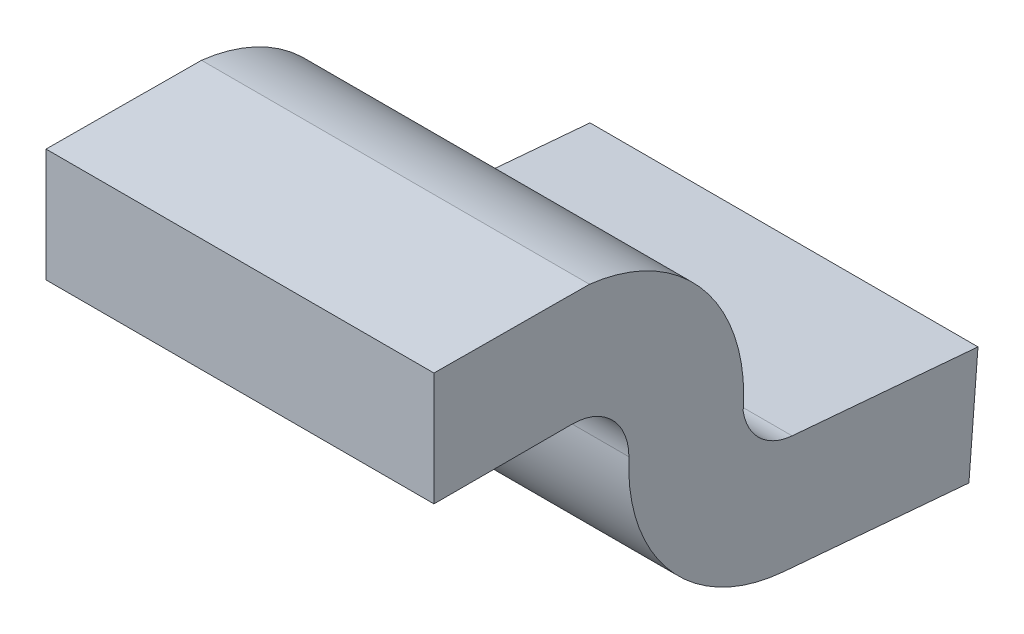
ISO-10303-21;
HEADER;
FILE_DESCRIPTION(('STEP AP214'),'2;1');
FILE_NAME('part.step','',(''),(''),'','','');
FILE_SCHEMA(('AUTOMOTIVE_DESIGN { 1 0 10303 214 1 1 1 1 }'));
ENDSEC;
DATA;
#1=APPLICATION_CONTEXT('core data for automotive mechanical design processes');
#2=APPLICATION_PROTOCOL_DEFINITION('international standard','automotive_design',2000,#1);
#3=PRODUCT_CONTEXT('',#1,'mechanical');
#4=PRODUCT('Part','Part','',(#3));
#5=PRODUCT_RELATED_PRODUCT_CATEGORY('part','',(#4));
#6=PRODUCT_DEFINITION_FORMATION('','',#4);
#7=PRODUCT_DEFINITION_CONTEXT('part definition',#1,'design');
#8=PRODUCT_DEFINITION('design','',#6,#7);
#9=PRODUCT_DEFINITION_SHAPE('','',#8);
#10=(LENGTH_UNIT() NAMED_UNIT(*) SI_UNIT(.MILLI.,.METRE.));
#11=(NAMED_UNIT(*) PLANE_ANGLE_UNIT() SI_UNIT($,.RADIAN.));
#12=(NAMED_UNIT(*) SI_UNIT($,.STERADIAN.) SOLID_ANGLE_UNIT());
#13=UNCERTAINTY_MEASURE_WITH_UNIT(LENGTH_MEASURE(1.E-05),#10,'distance_accuracy_value','');
#14=(GEOMETRIC_REPRESENTATION_CONTEXT(3) GLOBAL_UNCERTAINTY_ASSIGNED_CONTEXT((#13)) GLOBAL_UNIT_ASSIGNED_CONTEXT((#10,
#11,#12)) REPRESENTATION_CONTEXT('',''));
#15=CARTESIAN_POINT('',(0.,0.,0.));
#16=DIRECTION('',(0.,0.,1.));
#17=DIRECTION('',(1.,0.,0.));
#18=AXIS2_PLACEMENT_3D('',#15,#16,#17);
#19=CARTESIAN_POINT('',(-0.732499999999898,-0.286035813921941,-0.955975364706666));
#20=DIRECTION('',(-1.,0.,0.));
#21=DIRECTION('',(0.,0.,1.));
#22=AXIS2_PLACEMENT_3D('',#19,#20,#21);
#23=PLANE('',#22);
#24=DIRECTION('',(0.,0.,-1.));
#25=VECTOR('',#24,1.);
#26=CARTESIAN_POINT('',(-0.732499999999898,-0.207342465753367,-0.729300000000051));
#27=LINE('',#26,#25);
#28=CARTESIAN_POINT('',(-0.732499999999898,-0.207342465753367,-0.808600000000051));
#29=VERTEX_POINT('',#28);
#30=CARTESIAN_POINT('',(-0.732499999999898,-0.207342465753367,-0.650000000000052));
#31=VERTEX_POINT('',#30);
#32=EDGE_CURVE('E161',#29,#31,#27,.F.);
#33=ORIENTED_EDGE('',*,*,#32,.F.);
#34=CARTESIAN_POINT('',(-0.732499999999898,-0.272342465753368,-0.808600000000051));
#35=DIRECTION('',(1.,0.,0.));
#36=DIRECTION('',(0.,0.,-1.));
#37=AXIS2_PLACEMENT_3D('',#34,#35,#36);
#38=CIRCLE('',#37,0.0650000000000015);
#39=CARTESIAN_POINT('',(-0.732499999999898,-0.272342465753406,-0.873600000000052));
#40=VERTEX_POINT('',#39);
#41=EDGE_CURVE('E107',#29,#40,#38,.F.);
#42=ORIENTED_EDGE('',*,*,#41,.T.);
#43=CARTESIAN_POINT('',(-0.732499999999898,-0.281847041511176,-1.06740945721904));
#44=DIRECTION('',(1.,0.,0.));
#45=DIRECTION('',(0.,0.,-1.));
#46=AXIS2_PLACEMENT_3D('',#43,#44,#45);
#47=CIRCLE('',#46,0.194042373382344);
#48=CARTESIAN_POINT('',(-0.732499999999898,-0.475142465753367,-1.05040000000005));
#49=VERTEX_POINT('',#48);
#50=EDGE_CURVE('E113',#49,#40,#47,.F.);
#51=ORIENTED_EDGE('',*,*,#50,.F.);
#52=DIRECTION('',(0.,-0.0850564988837547,-0.996376129781137));
#53=VECTOR('',#52,1.);
#54=CARTESIAN_POINT('',(-0.732499999999898,-0.484242465753367,-1.15700000000005));
#55=LINE('',#54,#53);
#56=CARTESIAN_POINT('',(-0.732499999999898,-0.493342465753367,-1.26360000000005));
#57=VERTEX_POINT('',#56);
#58=EDGE_CURVE('E121',#57,#49,#55,.F.);
#59=ORIENTED_EDGE('',*,*,#58,.F.);
#60=DIRECTION('',(0.,0.996815278536125,-0.0797452222828947));
#61=VECTOR('',#60,1.);
#62=CARTESIAN_POINT('',(-0.732499999999898,-0.428342465753367,-1.26880000000005));
#63=LINE('',#62,#61);
#64=CARTESIAN_POINT('',(-0.732499999999898,-0.363342465753367,-1.27400000000005));
#65=VERTEX_POINT('',#64);
#66=EDGE_CURVE('E125',#65,#57,#63,.F.);
#67=ORIENTED_EDGE('',*,*,#66,.F.);
#68=DIRECTION('',(0.,0.0850564988837568,0.996376129781137));
#69=VECTOR('',#68,1.);
#70=CARTESIAN_POINT('',(-0.732499999999898,-0.354242465753367,-1.16740000000005));
#71=LINE('',#70,#69);
#72=CARTESIAN_POINT('',(-0.732499999999898,-0.345142465753367,-1.06080000000005));
#73=VERTEX_POINT('',#72);
#74=EDGE_CURVE('E138',#73,#65,#71,.F.);
#75=ORIENTED_EDGE('',*,*,#74,.F.);
#76=CARTESIAN_POINT('',(-0.732499999999898,-0.283260260937562,-1.06608262724043));
#77=DIRECTION('',(1.,0.,0.));
#78=DIRECTION('',(0.,0.,-1.));
#79=AXIS2_PLACEMENT_3D('',#76,#77,#78);
#80=CIRCLE('',#79,0.0621072735146688);
#81=CARTESIAN_POINT('',(-0.732499999999898,-0.292533083076196,-1.00467148661423));
#82=VERTEX_POINT('',#81);
#83=EDGE_CURVE('E71',#73,#82,#80,.F.);
#84=ORIENTED_EDGE('',*,*,#83,.T.);
#85=CARTESIAN_POINT('',(-0.732499999999898,-0.27704145293396,-0.805253294263886));
#86=DIRECTION('',(1.,0.,0.));
#87=DIRECTION('',(0.,0.,-1.));
#88=AXIS2_PLACEMENT_3D('',#85,#86,#87);
#89=CIRCLE('',#88,0.200019014208003);
#90=CARTESIAN_POINT('',(-0.732499999999898,-0.078361256304547,-0.82835709291344));
#91=VERTEX_POINT('',#90);
#92=EDGE_CURVE('E20',#91,#82,#89,.F.);
#93=ORIENTED_EDGE('',*,*,#92,.F.);
#94=DIRECTION('',(0.,0.00571198999967506,0.999983686452056));
#95=VECTOR('',#94,1.);
#96=CARTESIAN_POINT('',(-0.732499999999898,-0.0778518610289569,-0.739178546456744));
#97=LINE('',#96,#95);
#98=CARTESIAN_POINT('',(-0.732499999999898,-0.0773424657533665,-0.650000000000052));
#99=VERTEX_POINT('',#98);
#100=EDGE_CURVE('E150',#99,#91,#97,.F.);
#101=ORIENTED_EDGE('',*,*,#100,.F.);
#102=DIRECTION('',(0.,1.,0.));
#103=VECTOR('',#102,1.);
#104=CARTESIAN_POINT('',(-0.732499999999898,-0.142342465753367,-0.650000000000052));
#105=LINE('',#104,#103);
#106=EDGE_CURVE('E83',#31,#99,#105,.T.);
#107=ORIENTED_EDGE('',*,*,#106,.F.);
#108=EDGE_LOOP('',(#33,#42,#51,#59,#67,#75,#84,#93,#101,#107));
#109=FACE_BOUND('',#108,.T.);
#110=ADVANCED_FACE('F17',(#109),#23,.F.);
#111=CARTESIAN_POINT('',(-0.732499999999898,-0.207342465753367,-0.729300000000051));
#112=DIRECTION('',(0.,-1.,0.));
#113=DIRECTION('',(0.,0.,-1.));
#114=AXIS2_PLACEMENT_3D('',#111,#112,#113);
#115=PLANE('',#114);
#116=ORIENTED_EDGE('',*,*,#32,.T.);
#117=DIRECTION('',(1.,0.,0.));
#118=VECTOR('',#117,1.);
#119=CARTESIAN_POINT('',(-0.732499999999898,-0.207342465753367,-0.650000000000052));
#120=LINE('',#119,#118);
#121=CARTESIAN_POINT('',(-1.1774999999999,-0.207342465753367,-0.650000000000052));
#122=VERTEX_POINT('',#121);
#123=EDGE_CURVE('E92',#122,#31,#120,.T.);
#124=ORIENTED_EDGE('',*,*,#123,.F.);
#125=DIRECTION('',(0.,0.,1.));
#126=VECTOR('',#125,1.);
#127=CARTESIAN_POINT('',(-1.1774999999999,-0.207342465753367,-0.650000000000052));
#128=LINE('',#127,#126);
#129=CARTESIAN_POINT('',(-1.1774999999999,-0.207342465753367,-0.808600000000051));
#130=VERTEX_POINT('',#129);
#131=EDGE_CURVE('E98',#130,#122,#128,.T.);
#132=ORIENTED_EDGE('',*,*,#131,.F.);
#133=DIRECTION('',(1.,0.,0.));
#134=VECTOR('',#133,1.);
#135=CARTESIAN_POINT('',(-0.732499999999898,-0.207342465753367,-0.808600000000051));
#136=LINE('',#135,#134);
#137=EDGE_CURVE('E104',#130,#29,#136,.T.);
#138=ORIENTED_EDGE('',*,*,#137,.T.);
#139=EDGE_LOOP('',(#116,#124,#132,#138));
#140=FACE_BOUND('',#139,.T.);
#141=ADVANCED_FACE('F103',(#140),#115,.T.);
#142=CARTESIAN_POINT('',(-0.732499999999898,-0.142342465753367,-0.650000000000052));
#143=DIRECTION('',(0.,0.,1.));
#144=DIRECTION('',(1.,0.,0.));
#145=AXIS2_PLACEMENT_3D('',#142,#143,#144);
#146=PLANE('',#145);
#147=ORIENTED_EDGE('',*,*,#106,.T.);
#148=DIRECTION('',(1.,0.,0.));
#149=VECTOR('',#148,1.);
#150=CARTESIAN_POINT('',(-0.732499999999898,-0.0773424657533665,-0.650000000000052));
#151=LINE('',#150,#149);
#152=CARTESIAN_POINT('',(-1.1774999999999,-0.0773424657533665,-0.650000000000052));
#153=VERTEX_POINT('',#152);
#154=EDGE_CURVE('E151',#153,#99,#151,.T.);
#155=ORIENTED_EDGE('',*,*,#154,.F.);
#156=DIRECTION('',(0.,1.,0.));
#157=VECTOR('',#156,1.);
#158=CARTESIAN_POINT('',(-1.1774999999999,-0.0773424657533665,-0.650000000000052));
#159=LINE('',#158,#157);
#160=EDGE_CURVE('E106',#122,#153,#159,.T.);
#161=ORIENTED_EDGE('',*,*,#160,.F.);
#162=ORIENTED_EDGE('',*,*,#123,.T.);
#163=EDGE_LOOP('',(#147,#155,#161,#162));
#164=FACE_BOUND('',#163,.T.);
#165=ADVANCED_FACE('F222',(#164),#146,.T.);
#166=CARTESIAN_POINT('',(-0.732499999999898,-0.0778518610289569,-0.739178546456744));
#167=DIRECTION('',(0.,0.999983686452056,-0.00571198999967506));
#168=DIRECTION('',(0.,0.00571198999967506,0.999983686452056));
#169=AXIS2_PLACEMENT_3D('',#166,#167,#168);
#170=PLANE('',#169);
#171=ORIENTED_EDGE('',*,*,#100,.T.);
#172=DIRECTION('',(1.,0.,0.));
#173=VECTOR('',#172,1.);
#174=CARTESIAN_POINT('',(-0.732499999999898,-0.0783612563045467,-0.828357092913437));
#175=LINE('',#174,#173);
#176=CARTESIAN_POINT('',(-1.1774999999999,-0.0783612563045471,-0.82835709291344));
#177=VERTEX_POINT('',#176);
#178=EDGE_CURVE('E147',#177,#91,#175,.T.);
#179=ORIENTED_EDGE('',*,*,#178,.F.);
#180=DIRECTION('',(0.,-0.00571198999967528,-0.999983686452056));
#181=VECTOR('',#180,1.);
#182=CARTESIAN_POINT('',(-1.1774999999999,-0.0773424657533665,-0.650000000000052));
#183=LINE('',#182,#181);
#184=EDGE_CURVE('E157',#153,#177,#183,.T.);
#185=ORIENTED_EDGE('',*,*,#184,.F.);
#186=ORIENTED_EDGE('',*,*,#154,.T.);
#187=EDGE_LOOP('',(#171,#179,#185,#186));
#188=FACE_BOUND('',#187,.T.);
#189=ADVANCED_FACE('F221',(#188),#170,.T.);
#190=CARTESIAN_POINT('',(-0.732499999999898,-0.27704145293396,-0.805253294263886));
#191=DIRECTION('',(1.,0.,0.));
#192=DIRECTION('',(0.,0.,-1.));
#193=AXIS2_PLACEMENT_3D('',#190,#191,#192);
#194=CYLINDRICAL_SURFACE('',#193,0.200019014208003);
#195=DIRECTION('',(1.,0.,0.));
#196=VECTOR('',#195,1.);
#197=CARTESIAN_POINT('',(-0.732499999999898,-0.292533083076202,-1.00467148661423));
#198=LINE('',#197,#196);
#199=CARTESIAN_POINT('',(-1.1774999999999,-0.292533083076196,-1.00467148661423));
#200=VERTEX_POINT('',#199);
#201=EDGE_CURVE('E144',#82,#200,#198,.F.);
#202=ORIENTED_EDGE('',*,*,#201,.T.);
#203=CARTESIAN_POINT('',(-1.1774999999999,-0.27704145293396,-0.805253294263886));
#204=DIRECTION('',(1.,0.,0.));
#205=DIRECTION('',(0.,0.,-1.));
#206=AXIS2_PLACEMENT_3D('',#203,#204,#205);
#207=CIRCLE('',#206,0.200019014208003);
#208=EDGE_CURVE('E188',#177,#200,#207,.F.);
#209=ORIENTED_EDGE('',*,*,#208,.F.);
#210=ORIENTED_EDGE('',*,*,#178,.T.);
#211=ORIENTED_EDGE('',*,*,#92,.T.);
#212=EDGE_LOOP('',(#202,#209,#210,#211));
#213=FACE_BOUND('',#212,.T.);
#214=ADVANCED_FACE('F217',(#213),#194,.T.);
#215=CARTESIAN_POINT('',(-0.732499999999898,-0.283260260937562,-1.06608262724043));
#216=DIRECTION('',(1.,0.,0.));
#217=DIRECTION('',(0.,0.,-1.));
#218=AXIS2_PLACEMENT_3D('',#215,#216,#217);
#219=CYLINDRICAL_SURFACE('',#218,0.0621072735146688);
#220=ORIENTED_EDGE('',*,*,#83,.F.);
#221=DIRECTION('',(1.,0.,0.));
#222=VECTOR('',#221,1.);
#223=CARTESIAN_POINT('',(-0.732499999999898,-0.345142465753367,-1.06080000000005));
#224=LINE('',#223,#222);
#225=CARTESIAN_POINT('',(-1.1774999999999,-0.345142465753367,-1.06080000000005));
#226=VERTEX_POINT('',#225);
#227=EDGE_CURVE('E141',#226,#73,#224,.T.);
#228=ORIENTED_EDGE('',*,*,#227,.F.);
#229=CARTESIAN_POINT('',(-1.1774999999999,-0.283260260937562,-1.06608262724043));
#230=DIRECTION('',(1.,0.,0.));
#231=DIRECTION('',(0.,0.,-1.));
#232=AXIS2_PLACEMENT_3D('',#229,#230,#231);
#233=CIRCLE('',#232,0.0621072735146688);
#234=EDGE_CURVE('E186',#200,#226,#233,.T.);
#235=ORIENTED_EDGE('',*,*,#234,.F.);
#236=ORIENTED_EDGE('',*,*,#201,.F.);
#237=EDGE_LOOP('',(#220,#228,#235,#236));
#238=FACE_BOUND('',#237,.T.);
#239=ADVANCED_FACE('F213',(#238),#219,.F.);
#240=CARTESIAN_POINT('',(-0.732499999999898,-0.354242465753367,-1.16740000000005));
#241=DIRECTION('',(0.,0.996376129781137,-0.0850564988837568));
#242=DIRECTION('',(0.,0.0850564988837568,0.996376129781137));
#243=AXIS2_PLACEMENT_3D('',#240,#241,#242);
#244=PLANE('',#243);
#245=ORIENTED_EDGE('',*,*,#74,.T.);
#246=DIRECTION('',(1.,0.,0.));
#247=VECTOR('',#246,1.);
#248=CARTESIAN_POINT('',(-0.732499999999898,-0.363342465753367,-1.27400000000005));
#249=LINE('',#248,#247);
#250=CARTESIAN_POINT('',(-1.1774999999999,-0.363342465753367,-1.27400000000005));
#251=VERTEX_POINT('',#250);
#252=EDGE_CURVE('E135',#251,#65,#249,.T.);
#253=ORIENTED_EDGE('',*,*,#252,.F.);
#254=DIRECTION('',(0.,-0.0850564988837553,-0.996376129781137));
#255=VECTOR('',#254,1.);
#256=CARTESIAN_POINT('',(-1.1774999999999,-0.345142465753367,-1.06080000000005));
#257=LINE('',#256,#255);
#258=EDGE_CURVE('E132',#226,#251,#257,.T.);
#259=ORIENTED_EDGE('',*,*,#258,.F.);
#260=ORIENTED_EDGE('',*,*,#227,.T.);
#261=EDGE_LOOP('',(#245,#253,#259,#260));
#262=FACE_BOUND('',#261,.T.);
#263=ADVANCED_FACE('F208',(#262),#244,.T.);
#264=CARTESIAN_POINT('',(-0.732499999999898,-0.428342465753367,-1.26880000000005));
#265=DIRECTION('',(0.,-0.0797452222828947,-0.996815278536125));
#266=DIRECTION('',(0.,0.996815278536125,-0.0797452222828947));
#267=AXIS2_PLACEMENT_3D('',#264,#265,#266);
#268=PLANE('',#267);
#269=ORIENTED_EDGE('',*,*,#66,.T.);
#270=DIRECTION('',(1.,0.,0.));
#271=VECTOR('',#270,1.);
#272=CARTESIAN_POINT('',(-0.732499999999898,-0.493342465753367,-1.26360000000005));
#273=LINE('',#272,#271);
#274=CARTESIAN_POINT('',(-1.1774999999999,-0.493342465753367,-1.26360000000005));
#275=VERTEX_POINT('',#274);
#276=EDGE_CURVE('E122',#275,#57,#273,.T.);
#277=ORIENTED_EDGE('',*,*,#276,.F.);
#278=DIRECTION('',(0.,-0.996815278536125,0.0797452222828903));
#279=VECTOR('',#278,1.);
#280=CARTESIAN_POINT('',(-1.1774999999999,-0.363342465753367,-1.27400000000005));
#281=LINE('',#280,#279);
#282=EDGE_CURVE('E128',#251,#275,#281,.T.);
#283=ORIENTED_EDGE('',*,*,#282,.F.);
#284=ORIENTED_EDGE('',*,*,#252,.T.);
#285=EDGE_LOOP('',(#269,#277,#283,#284));
#286=FACE_BOUND('',#285,.T.);
#287=ADVANCED_FACE('F202',(#286),#268,.T.);
#288=CARTESIAN_POINT('',(-0.732499999999898,-0.484242465753367,-1.15700000000005));
#289=DIRECTION('',(0.,-0.996376129781137,0.0850564988837547));
#290=DIRECTION('',(0.,-0.0850564988837547,-0.996376129781137));
#291=AXIS2_PLACEMENT_3D('',#288,#289,#290);
#292=PLANE('',#291);
#293=ORIENTED_EDGE('',*,*,#58,.T.);
#294=DIRECTION('',(1.,0.,0.));
#295=VECTOR('',#294,1.);
#296=CARTESIAN_POINT('',(-0.732499999999898,-0.475142465753366,-1.05040000000005));
#297=LINE('',#296,#295);
#298=CARTESIAN_POINT('',(-1.1774999999999,-0.475142465753367,-1.05040000000005));
#299=VERTEX_POINT('',#298);
#300=EDGE_CURVE('E118',#299,#49,#297,.T.);
#301=ORIENTED_EDGE('',*,*,#300,.F.);
#302=DIRECTION('',(0.,0.0850564988837557,0.996376129781137));
#303=VECTOR('',#302,1.);
#304=CARTESIAN_POINT('',(-1.1774999999999,-0.493342465753367,-1.26360000000005));
#305=LINE('',#304,#303);
#306=EDGE_CURVE('E131',#275,#299,#305,.T.);
#307=ORIENTED_EDGE('',*,*,#306,.F.);
#308=ORIENTED_EDGE('',*,*,#276,.T.);
#309=EDGE_LOOP('',(#293,#301,#307,#308));
#310=FACE_BOUND('',#309,.T.);
#311=ADVANCED_FACE('F196',(#310),#292,.T.);
#312=CARTESIAN_POINT('',(-0.732499999999898,-0.281847041511176,-1.06740945721904));
#313=DIRECTION('',(1.,0.,0.));
#314=DIRECTION('',(0.,0.,-1.));
#315=AXIS2_PLACEMENT_3D('',#312,#313,#314);
#316=CYLINDRICAL_SURFACE('',#315,0.194042373382344);
#317=DIRECTION('',(1.,0.,0.));
#318=VECTOR('',#317,1.);
#319=CARTESIAN_POINT('',(-0.732499999999898,-0.272342465753368,-0.873600000000052));
#320=LINE('',#319,#318);
#321=CARTESIAN_POINT('',(-1.1774999999999,-0.272342465753406,-0.873600000000052));
#322=VERTEX_POINT('',#321);
#323=EDGE_CURVE('E110',#40,#322,#320,.F.);
#324=ORIENTED_EDGE('',*,*,#323,.T.);
#325=CARTESIAN_POINT('',(-1.1774999999999,-0.281847041511176,-1.06740945721904));
#326=DIRECTION('',(1.,0.,0.));
#327=DIRECTION('',(0.,0.,-1.));
#328=AXIS2_PLACEMENT_3D('',#325,#326,#327);
#329=CIRCLE('',#328,0.194042373382344);
#330=EDGE_CURVE('E26',#299,#322,#329,.F.);
#331=ORIENTED_EDGE('',*,*,#330,.F.);
#332=ORIENTED_EDGE('',*,*,#300,.T.);
#333=ORIENTED_EDGE('',*,*,#50,.T.);
#334=EDGE_LOOP('',(#324,#331,#332,#333));
#335=FACE_BOUND('',#334,.T.);
#336=ADVANCED_FACE('F192',(#335),#316,.T.);
#337=CARTESIAN_POINT('',(-0.732499999999898,-0.272342465753368,-0.808600000000051));
#338=DIRECTION('',(1.,0.,0.));
#339=DIRECTION('',(0.,0.,-1.));
#340=AXIS2_PLACEMENT_3D('',#337,#338,#339);
#341=CYLINDRICAL_SURFACE('',#340,0.0650000000000015);
#342=ORIENTED_EDGE('',*,*,#41,.F.);
#343=ORIENTED_EDGE('',*,*,#137,.F.);
#344=CARTESIAN_POINT('',(-1.1774999999999,-0.272342465753368,-0.808600000000051));
#345=DIRECTION('',(1.,0.,0.));
#346=DIRECTION('',(0.,0.,-1.));
#347=AXIS2_PLACEMENT_3D('',#344,#345,#346);
#348=CIRCLE('',#347,0.0650000000000015);
#349=EDGE_CURVE('E11',#322,#130,#348,.T.);
#350=ORIENTED_EDGE('',*,*,#349,.F.);
#351=ORIENTED_EDGE('',*,*,#323,.F.);
#352=EDGE_LOOP('',(#342,#343,#350,#351));
#353=FACE_BOUND('',#352,.T.);
#354=ADVANCED_FACE('F109',(#353),#341,.F.);
#355=CARTESIAN_POINT('',(-1.1774999999999,-0.0773424657533665,-0.650000000000052));
#356=DIRECTION('',(-1.,0.,0.));
#357=DIRECTION('',(0.,0.,1.));
#358=AXIS2_PLACEMENT_3D('',#355,#356,#357);
#359=PLANE('',#358);
#360=ORIENTED_EDGE('',*,*,#349,.T.);
#361=ORIENTED_EDGE('',*,*,#131,.T.);
#362=ORIENTED_EDGE('',*,*,#160,.T.);
#363=ORIENTED_EDGE('',*,*,#184,.T.);
#364=ORIENTED_EDGE('',*,*,#208,.T.);
#365=ORIENTED_EDGE('',*,*,#234,.T.);
#366=ORIENTED_EDGE('',*,*,#258,.T.);
#367=ORIENTED_EDGE('',*,*,#282,.T.);
#368=ORIENTED_EDGE('',*,*,#306,.T.);
#369=ORIENTED_EDGE('',*,*,#330,.T.);
#370=EDGE_LOOP('',(#360,#361,#362,#363,#364,#365,#366,#367,#368,#369));
#371=FACE_BOUND('',#370,.T.);
#372=ADVANCED_FACE('F96',(#371),#359,.T.);
#373=CLOSED_SHELL('',(#110,#141,#165,#189,#214,#239,#263,#287,#311,#336,#354,#372));
#374=MANIFOLD_SOLID_BREP('B1',#373);
#375=ADVANCED_BREP_SHAPE_REPRESENTATION('',(#18,#374),#14);
#376=SHAPE_DEFINITION_REPRESENTATION(#9,#375);
ENDSEC;
END-ISO-10303-21;
